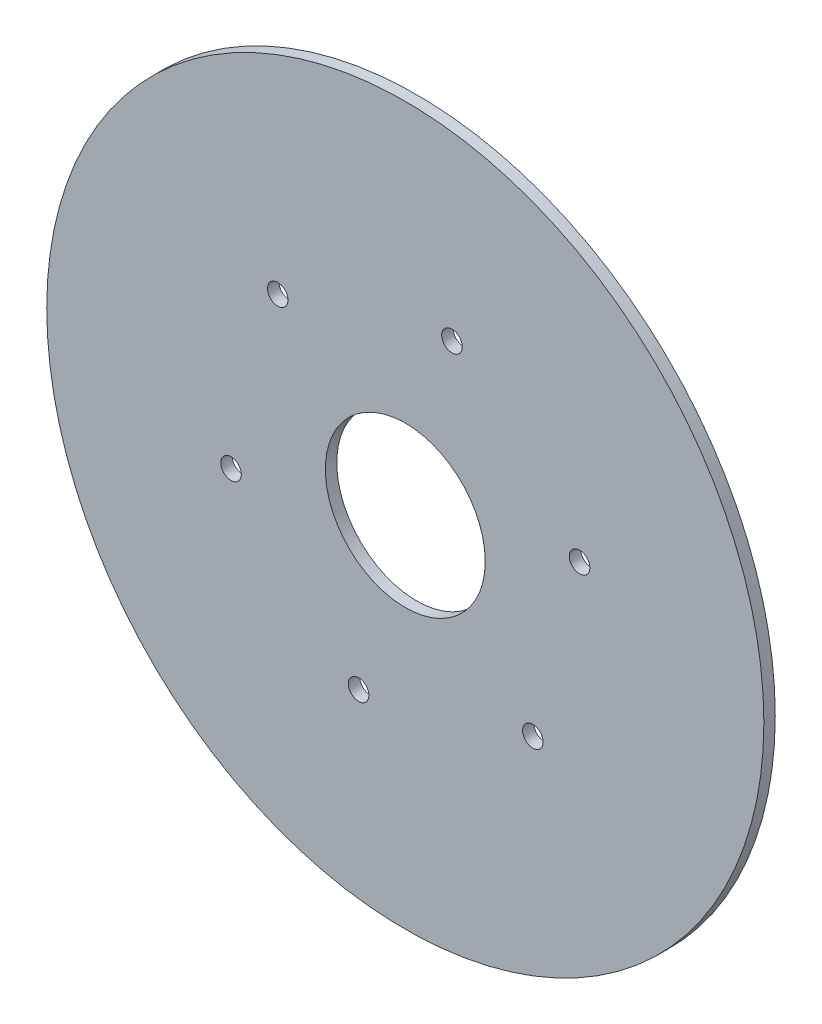
ISO-10303-21;
HEADER;
FILE_DESCRIPTION(('STEP AP214'),'2;1');
FILE_NAME('part.step','',(''),(''),'','','');
FILE_SCHEMA(('AUTOMOTIVE_DESIGN { 1 0 10303 214 1 1 1 1 }'));
ENDSEC;
DATA;
#1=APPLICATION_CONTEXT('core data for automotive mechanical design processes');
#2=APPLICATION_PROTOCOL_DEFINITION('international standard','automotive_design',2000,#1);
#3=PRODUCT_CONTEXT('',#1,'mechanical');
#4=PRODUCT('Part','Part','',(#3));
#5=PRODUCT_RELATED_PRODUCT_CATEGORY('part','',(#4));
#6=PRODUCT_DEFINITION_FORMATION('','',#4);
#7=PRODUCT_DEFINITION_CONTEXT('part definition',#1,'design');
#8=PRODUCT_DEFINITION('design','',#6,#7);
#9=PRODUCT_DEFINITION_SHAPE('','',#8);
#10=(LENGTH_UNIT() NAMED_UNIT(*) SI_UNIT(.MILLI.,.METRE.));
#11=(NAMED_UNIT(*) PLANE_ANGLE_UNIT() SI_UNIT($,.RADIAN.));
#12=(NAMED_UNIT(*) SI_UNIT($,.STERADIAN.) SOLID_ANGLE_UNIT());
#13=UNCERTAINTY_MEASURE_WITH_UNIT(LENGTH_MEASURE(1.E-05),#10,'distance_accuracy_value','');
#14=(GEOMETRIC_REPRESENTATION_CONTEXT(3) GLOBAL_UNCERTAINTY_ASSIGNED_CONTEXT((#13)) GLOBAL_UNIT_ASSIGNED_CONTEXT((#10,
#11,#12)) REPRESENTATION_CONTEXT('',''));
#15=CARTESIAN_POINT('',(0.,0.,0.));
#16=DIRECTION('',(0.,0.,1.));
#17=DIRECTION('',(1.,0.,0.));
#18=AXIS2_PLACEMENT_3D('',#15,#16,#17);
#19=CARTESIAN_POINT('',(0.,0.,61.));
#20=DIRECTION('',(0.,0.,1.));
#21=DIRECTION('',(1.,0.,0.));
#22=AXIS2_PLACEMENT_3D('',#19,#20,#21);
#23=PLANE('',#22);
#24=CARTESIAN_POINT('',(38.1540701384182,10.2233522815496,61.));
#25=DIRECTION('',(0.,0.,1.));
#26=DIRECTION('',(1.,0.,0.));
#27=AXIS2_PLACEMENT_3D('',#24,#25,#26);
#28=CIRCLE('',#27,2.25);
#29=CARTESIAN_POINT('',(40.4040701384182,10.2233522815496,61.));
#30=VERTEX_POINT('',#29);
#31=EDGE_CURVE('E97',#30,#30,#28,.T.);
#32=ORIENTED_EDGE('',*,*,#31,.F.);
#33=EDGE_LOOP('',(#32));
#34=FACE_BOUND('',#33,.T.);
#35=CARTESIAN_POINT('',(10.2233522815496,38.1540701384182,61.));
#36=DIRECTION('',(0.,0.,1.));
#37=DIRECTION('',(1.,0.,0.));
#38=AXIS2_PLACEMENT_3D('',#35,#36,#37);
#39=CIRCLE('',#38,2.25);
#40=CARTESIAN_POINT('',(12.4733522815496,38.1540701384182,61.));
#41=VERTEX_POINT('',#40);
#42=EDGE_CURVE('E81',#41,#41,#39,.T.);
#43=ORIENTED_EDGE('',*,*,#42,.F.);
#44=EDGE_LOOP('',(#43));
#45=FACE_BOUND('',#44,.T.);
#46=CARTESIAN_POINT('',(-27.9307178568686,27.9307178568686,61.));
#47=DIRECTION('',(0.,0.,1.));
#48=DIRECTION('',(1.,0.,0.));
#49=AXIS2_PLACEMENT_3D('',#46,#47,#48);
#50=CIRCLE('',#49,2.25);
#51=CARTESIAN_POINT('',(-25.6807178568686,27.9307178568686,61.));
#52=VERTEX_POINT('',#51);
#53=EDGE_CURVE('E77',#52,#52,#50,.T.);
#54=ORIENTED_EDGE('',*,*,#53,.F.);
#55=EDGE_LOOP('',(#54));
#56=FACE_BOUND('',#55,.T.);
#57=CARTESIAN_POINT('',(-38.1540701384182,-10.2233522815496,61.));
#58=DIRECTION('',(0.,0.,1.));
#59=DIRECTION('',(1.,0.,0.));
#60=AXIS2_PLACEMENT_3D('',#57,#58,#59);
#61=CIRCLE('',#60,2.25);
#62=CARTESIAN_POINT('',(-35.9040701384182,-10.2233522815496,61.));
#63=VERTEX_POINT('',#62);
#64=EDGE_CURVE('E73',#63,#63,#61,.T.);
#65=ORIENTED_EDGE('',*,*,#64,.F.);
#66=EDGE_LOOP('',(#65));
#67=FACE_BOUND('',#66,.T.);
#68=CARTESIAN_POINT('',(-10.2233522815496,-38.1540701384182,61.));
#69=DIRECTION('',(0.,0.,1.));
#70=DIRECTION('',(1.,0.,0.));
#71=AXIS2_PLACEMENT_3D('',#68,#69,#70);
#72=CIRCLE('',#71,2.25);
#73=CARTESIAN_POINT('',(-7.9733522815496,-38.1540701384182,61.));
#74=VERTEX_POINT('',#73);
#75=EDGE_CURVE('E68',#74,#74,#72,.T.);
#76=ORIENTED_EDGE('',*,*,#75,.F.);
#77=EDGE_LOOP('',(#76));
#78=FACE_BOUND('',#77,.T.);
#79=CARTESIAN_POINT('',(27.9307178568686,-27.9307178568686,61.));
#80=DIRECTION('',(0.,0.,1.));
#81=DIRECTION('',(1.,0.,0.));
#82=AXIS2_PLACEMENT_3D('',#79,#80,#81);
#83=CIRCLE('',#82,2.25);
#84=CARTESIAN_POINT('',(30.1807178568686,-27.9307178568686,61.));
#85=VERTEX_POINT('',#84);
#86=EDGE_CURVE('E63',#85,#85,#83,.T.);
#87=ORIENTED_EDGE('',*,*,#86,.F.);
#88=EDGE_LOOP('',(#87));
#89=FACE_BOUND('',#88,.T.);
#90=CARTESIAN_POINT('',(0.,0.,61.));
#91=DIRECTION('',(0.,0.,1.));
#92=DIRECTION('',(1.,0.,0.));
#93=AXIS2_PLACEMENT_3D('',#90,#91,#92);
#94=CIRCLE('',#93,78.5);
#95=CARTESIAN_POINT('',(78.5,0.,61.));
#96=VERTEX_POINT('',#95);
#97=EDGE_CURVE('E10',#96,#96,#94,.T.);
#98=ORIENTED_EDGE('',*,*,#97,.T.);
#99=EDGE_LOOP('',(#98));
#100=FACE_BOUND('',#99,.T.);
#101=CARTESIAN_POINT('',(0.,0.,61.));
#102=DIRECTION('',(0.,0.,1.));
#103=DIRECTION('',(1.,0.,0.));
#104=AXIS2_PLACEMENT_3D('',#101,#102,#103);
#105=CIRCLE('',#104,17.5);
#106=CARTESIAN_POINT('',(17.5,0.,61.));
#107=VERTEX_POINT('',#106);
#108=EDGE_CURVE('E53',#107,#107,#105,.T.);
#109=ORIENTED_EDGE('',*,*,#108,.F.);
#110=EDGE_LOOP('',(#109));
#111=FACE_BOUND('',#110,.T.);
#112=ADVANCED_FACE('F36',(#34,#45,#56,#67,#78,#89,#100,#111),#23,.T.);
#113=CARTESIAN_POINT('',(0.,0.,58.5));
#114=DIRECTION('',(0.,0.,1.));
#115=DIRECTION('',(1.,0.,0.));
#116=AXIS2_PLACEMENT_3D('',#113,#114,#115);
#117=PLANE('',#116);
#118=CARTESIAN_POINT('',(38.1540701384182,10.2233522815496,58.5));
#119=DIRECTION('',(0.,0.,1.));
#120=DIRECTION('',(1.,0.,0.));
#121=AXIS2_PLACEMENT_3D('',#118,#119,#120);
#122=CIRCLE('',#121,2.25);
#123=CARTESIAN_POINT('',(40.4040701384182,10.2233522815496,58.5));
#124=VERTEX_POINT('',#123);
#125=EDGE_CURVE('E40',#124,#124,#122,.T.);
#126=ORIENTED_EDGE('',*,*,#125,.T.);
#127=EDGE_LOOP('',(#126));
#128=FACE_BOUND('',#127,.T.);
#129=CARTESIAN_POINT('',(10.2233522815496,38.1540701384182,58.5));
#130=DIRECTION('',(0.,0.,1.));
#131=DIRECTION('',(1.,0.,0.));
#132=AXIS2_PLACEMENT_3D('',#129,#130,#131);
#133=CIRCLE('',#132,2.25);
#134=CARTESIAN_POINT('',(12.4733522815496,38.1540701384182,58.5));
#135=VERTEX_POINT('',#134);
#136=EDGE_CURVE('E78',#135,#135,#133,.T.);
#137=ORIENTED_EDGE('',*,*,#136,.T.);
#138=EDGE_LOOP('',(#137));
#139=FACE_BOUND('',#138,.T.);
#140=CARTESIAN_POINT('',(-27.9307178568686,27.9307178568686,58.5));
#141=DIRECTION('',(0.,0.,1.));
#142=DIRECTION('',(1.,0.,0.));
#143=AXIS2_PLACEMENT_3D('',#140,#141,#142);
#144=CIRCLE('',#143,2.25);
#145=CARTESIAN_POINT('',(-25.6807178568686,27.9307178568686,58.5));
#146=VERTEX_POINT('',#145);
#147=EDGE_CURVE('E74',#146,#146,#144,.T.);
#148=ORIENTED_EDGE('',*,*,#147,.T.);
#149=EDGE_LOOP('',(#148));
#150=FACE_BOUND('',#149,.T.);
#151=CARTESIAN_POINT('',(-38.1540701384182,-10.2233522815496,58.5));
#152=DIRECTION('',(0.,0.,1.));
#153=DIRECTION('',(1.,0.,0.));
#154=AXIS2_PLACEMENT_3D('',#151,#152,#153);
#155=CIRCLE('',#154,2.25);
#156=CARTESIAN_POINT('',(-35.9040701384182,-10.2233522815496,58.5));
#157=VERTEX_POINT('',#156);
#158=EDGE_CURVE('E69',#157,#157,#155,.T.);
#159=ORIENTED_EDGE('',*,*,#158,.T.);
#160=EDGE_LOOP('',(#159));
#161=FACE_BOUND('',#160,.T.);
#162=CARTESIAN_POINT('',(-10.2233522815496,-38.1540701384182,58.5));
#163=DIRECTION('',(0.,0.,1.));
#164=DIRECTION('',(1.,0.,0.));
#165=AXIS2_PLACEMENT_3D('',#162,#163,#164);
#166=CIRCLE('',#165,2.25);
#167=CARTESIAN_POINT('',(-7.9733522815496,-38.1540701384182,58.5));
#168=VERTEX_POINT('',#167);
#169=EDGE_CURVE('E64',#168,#168,#166,.T.);
#170=ORIENTED_EDGE('',*,*,#169,.T.);
#171=EDGE_LOOP('',(#170));
#172=FACE_BOUND('',#171,.T.);
#173=CARTESIAN_POINT('',(27.9307178568686,-27.9307178568686,58.5));
#174=DIRECTION('',(0.,0.,1.));
#175=DIRECTION('',(1.,0.,0.));
#176=AXIS2_PLACEMENT_3D('',#173,#174,#175);
#177=CIRCLE('',#176,2.25);
#178=CARTESIAN_POINT('',(30.1807178568686,-27.9307178568686,58.5));
#179=VERTEX_POINT('',#178);
#180=EDGE_CURVE('E59',#179,#179,#177,.T.);
#181=ORIENTED_EDGE('',*,*,#180,.T.);
#182=EDGE_LOOP('',(#181));
#183=FACE_BOUND('',#182,.T.);
#184=CARTESIAN_POINT('',(0.,0.,58.5));
#185=DIRECTION('',(0.,0.,1.));
#186=DIRECTION('',(1.,0.,0.));
#187=AXIS2_PLACEMENT_3D('',#184,#185,#186);
#188=CIRCLE('',#187,78.5);
#189=CARTESIAN_POINT('',(78.5,0.,58.5));
#190=VERTEX_POINT('',#189);
#191=EDGE_CURVE('E45',#190,#190,#188,.T.);
#192=ORIENTED_EDGE('',*,*,#191,.F.);
#193=EDGE_LOOP('',(#192));
#194=FACE_BOUND('',#193,.T.);
#195=CARTESIAN_POINT('',(0.,0.,58.5));
#196=DIRECTION('',(0.,0.,1.));
#197=DIRECTION('',(1.,0.,0.));
#198=AXIS2_PLACEMENT_3D('',#195,#196,#197);
#199=CIRCLE('',#198,17.5);
#200=CARTESIAN_POINT('',(17.5,0.,58.5));
#201=VERTEX_POINT('',#200);
#202=EDGE_CURVE('E56',#201,#201,#199,.T.);
#203=ORIENTED_EDGE('',*,*,#202,.T.);
#204=EDGE_LOOP('',(#203));
#205=FACE_BOUND('',#204,.T.);
#206=ADVANCED_FACE('F106',(#128,#139,#150,#161,#172,#183,#194,#205),#117,.F.);
#207=CARTESIAN_POINT('',(0.,0.,61.));
#208=DIRECTION('',(0.,0.,-1.));
#209=DIRECTION('',(-1.,0.,0.));
#210=AXIS2_PLACEMENT_3D('',#207,#208,#209);
#211=CYLINDRICAL_SURFACE('',#210,78.5);
#212=ORIENTED_EDGE('',*,*,#97,.F.);
#213=EDGE_LOOP('',(#212));
#214=FACE_BOUND('',#213,.T.);
#215=ORIENTED_EDGE('',*,*,#191,.T.);
#216=EDGE_LOOP('',(#215));
#217=FACE_BOUND('',#216,.T.);
#218=ADVANCED_FACE('F38',(#214,#217),#211,.T.);
#219=CARTESIAN_POINT('',(0.,0.,61.));
#220=DIRECTION('',(0.,0.,-1.));
#221=DIRECTION('',(-1.,0.,0.));
#222=AXIS2_PLACEMENT_3D('',#219,#220,#221);
#223=CYLINDRICAL_SURFACE('',#222,17.5);
#224=ORIENTED_EDGE('',*,*,#108,.T.);
#225=EDGE_LOOP('',(#224));
#226=FACE_BOUND('',#225,.T.);
#227=ORIENTED_EDGE('',*,*,#202,.F.);
#228=EDGE_LOOP('',(#227));
#229=FACE_BOUND('',#228,.T.);
#230=ADVANCED_FACE('F108',(#226,#229),#223,.F.);
#231=CARTESIAN_POINT('',(27.9307178568686,-27.9307178568686,-100.));
#232=DIRECTION('',(0.,0.,1.));
#233=DIRECTION('',(1.,0.,0.));
#234=AXIS2_PLACEMENT_3D('',#231,#232,#233);
#235=CYLINDRICAL_SURFACE('',#234,2.25);
#236=ORIENTED_EDGE('',*,*,#86,.T.);
#237=EDGE_LOOP('',(#236));
#238=FACE_BOUND('',#237,.T.);
#239=ORIENTED_EDGE('',*,*,#180,.F.);
#240=EDGE_LOOP('',(#239));
#241=FACE_BOUND('',#240,.T.);
#242=ADVANCED_FACE('F110',(#238,#241),#235,.F.);
#243=CARTESIAN_POINT('',(-10.2233522815496,-38.1540701384182,-100.));
#244=DIRECTION('',(0.,0.,1.));
#245=DIRECTION('',(1.,0.,0.));
#246=AXIS2_PLACEMENT_3D('',#243,#244,#245);
#247=CYLINDRICAL_SURFACE('',#246,2.25);
#248=ORIENTED_EDGE('',*,*,#75,.T.);
#249=EDGE_LOOP('',(#248));
#250=FACE_BOUND('',#249,.T.);
#251=ORIENTED_EDGE('',*,*,#169,.F.);
#252=EDGE_LOOP('',(#251));
#253=FACE_BOUND('',#252,.T.);
#254=ADVANCED_FACE('F116',(#250,#253),#247,.F.);
#255=CARTESIAN_POINT('',(-38.1540701384182,-10.2233522815496,-100.));
#256=DIRECTION('',(0.,0.,1.));
#257=DIRECTION('',(1.,0.,0.));
#258=AXIS2_PLACEMENT_3D('',#255,#256,#257);
#259=CYLINDRICAL_SURFACE('',#258,2.25);
#260=ORIENTED_EDGE('',*,*,#64,.T.);
#261=EDGE_LOOP('',(#260));
#262=FACE_BOUND('',#261,.T.);
#263=ORIENTED_EDGE('',*,*,#158,.F.);
#264=EDGE_LOOP('',(#263));
#265=FACE_BOUND('',#264,.T.);
#266=ADVANCED_FACE('F145',(#262,#265),#259,.F.);
#267=CARTESIAN_POINT('',(-27.9307178568686,27.9307178568686,-100.));
#268=DIRECTION('',(0.,0.,1.));
#269=DIRECTION('',(1.,0.,0.));
#270=AXIS2_PLACEMENT_3D('',#267,#268,#269);
#271=CYLINDRICAL_SURFACE('',#270,2.25);
#272=ORIENTED_EDGE('',*,*,#53,.T.);
#273=EDGE_LOOP('',(#272));
#274=FACE_BOUND('',#273,.T.);
#275=ORIENTED_EDGE('',*,*,#147,.F.);
#276=EDGE_LOOP('',(#275));
#277=FACE_BOUND('',#276,.T.);
#278=ADVANCED_FACE('F158',(#274,#277),#271,.F.);
#279=CARTESIAN_POINT('',(10.2233522815496,38.1540701384182,-100.));
#280=DIRECTION('',(0.,0.,1.));
#281=DIRECTION('',(1.,0.,0.));
#282=AXIS2_PLACEMENT_3D('',#279,#280,#281);
#283=CYLINDRICAL_SURFACE('',#282,2.25);
#284=ORIENTED_EDGE('',*,*,#42,.T.);
#285=EDGE_LOOP('',(#284));
#286=FACE_BOUND('',#285,.T.);
#287=ORIENTED_EDGE('',*,*,#136,.F.);
#288=EDGE_LOOP('',(#287));
#289=FACE_BOUND('',#288,.T.);
#290=ADVANCED_FACE('F164',(#286,#289),#283,.F.);
#291=CARTESIAN_POINT('',(38.1540701384182,10.2233522815496,-100.));
#292=DIRECTION('',(0.,0.,1.));
#293=DIRECTION('',(1.,0.,0.));
#294=AXIS2_PLACEMENT_3D('',#291,#292,#293);
#295=CYLINDRICAL_SURFACE('',#294,2.25);
#296=ORIENTED_EDGE('',*,*,#31,.T.);
#297=EDGE_LOOP('',(#296));
#298=FACE_BOUND('',#297,.T.);
#299=ORIENTED_EDGE('',*,*,#125,.F.);
#300=EDGE_LOOP('',(#299));
#301=FACE_BOUND('',#300,.T.);
#302=ADVANCED_FACE('F167',(#298,#301),#295,.F.);
#303=CLOSED_SHELL('',(#112,#206,#218,#230,#242,#254,#266,#278,#290,#302));
#304=MANIFOLD_SOLID_BREP('B2',#303);
#305=ADVANCED_BREP_SHAPE_REPRESENTATION('',(#18,#304),#14);
#306=SHAPE_DEFINITION_REPRESENTATION(#9,#305);
ENDSEC;
END-ISO-10303-21;
